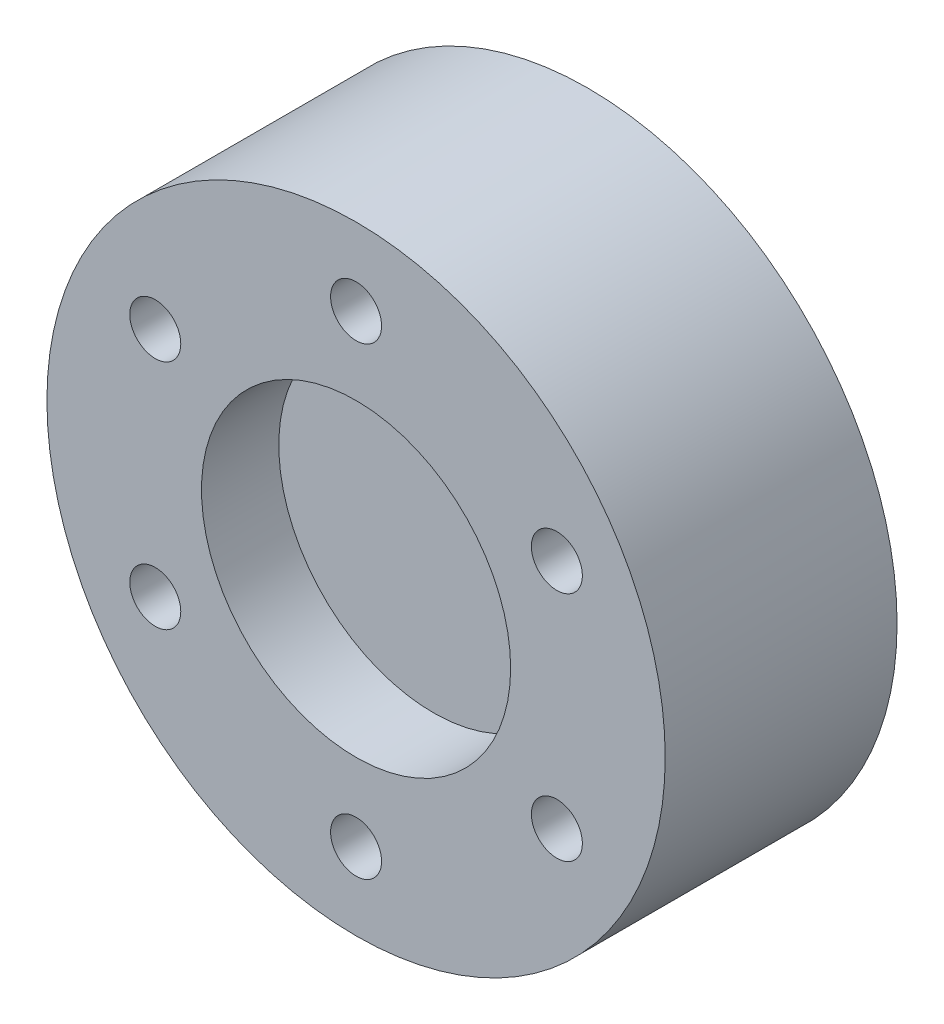
ISO-10303-21;
HEADER;
FILE_DESCRIPTION(('STEP AP214'),'2;1');
FILE_NAME('part.step','',(''),(''),'','','');
FILE_SCHEMA(('AUTOMOTIVE_DESIGN { 1 0 10303 214 1 1 1 1 }'));
ENDSEC;
DATA;
#1=APPLICATION_CONTEXT('core data for automotive mechanical design processes');
#2=APPLICATION_PROTOCOL_DEFINITION('international standard','automotive_design',2000,#1);
#3=PRODUCT_CONTEXT('',#1,'mechanical');
#4=PRODUCT('Part','Part','',(#3));
#5=PRODUCT_RELATED_PRODUCT_CATEGORY('part','',(#4));
#6=PRODUCT_DEFINITION_FORMATION('','',#4);
#7=PRODUCT_DEFINITION_CONTEXT('part definition',#1,'design');
#8=PRODUCT_DEFINITION('design','',#6,#7);
#9=PRODUCT_DEFINITION_SHAPE('','',#8);
#10=(LENGTH_UNIT() NAMED_UNIT(*) SI_UNIT(.MILLI.,.METRE.));
#11=(NAMED_UNIT(*) PLANE_ANGLE_UNIT() SI_UNIT($,.RADIAN.));
#12=(NAMED_UNIT(*) SI_UNIT($,.STERADIAN.) SOLID_ANGLE_UNIT());
#13=UNCERTAINTY_MEASURE_WITH_UNIT(LENGTH_MEASURE(1.E-05),#10,'distance_accuracy_value','');
#14=(GEOMETRIC_REPRESENTATION_CONTEXT(3) GLOBAL_UNCERTAINTY_ASSIGNED_CONTEXT((#13)) GLOBAL_UNIT_ASSIGNED_CONTEXT((#10,
#11,#12)) REPRESENTATION_CONTEXT('',''));
#15=CARTESIAN_POINT('',(0.,0.,0.));
#16=DIRECTION('',(0.,0.,1.));
#17=DIRECTION('',(1.,0.,0.));
#18=AXIS2_PLACEMENT_3D('',#15,#16,#17);
#19=CARTESIAN_POINT('',(0.,0.,15.));
#20=DIRECTION('',(0.,0.,-1.));
#21=DIRECTION('',(-1.,0.,0.));
#22=AXIS2_PLACEMENT_3D('',#19,#20,#21);
#23=CYLINDRICAL_SURFACE('',#22,20.);
#24=CARTESIAN_POINT('',(0.,0.,15.));
#25=DIRECTION('',(0.,0.,1.));
#26=DIRECTION('',(1.,0.,0.));
#27=AXIS2_PLACEMENT_3D('',#24,#25,#26);
#28=CIRCLE('',#27,20.);
#29=CARTESIAN_POINT('',(20.,0.,15.));
#30=VERTEX_POINT('',#29);
#31=EDGE_CURVE('E11',#30,#30,#28,.T.);
#32=ORIENTED_EDGE('',*,*,#31,.F.);
#33=EDGE_LOOP('',(#32));
#34=FACE_BOUND('',#33,.T.);
#35=CARTESIAN_POINT('',(0.,0.,0.));
#36=DIRECTION('',(0.,0.,1.));
#37=DIRECTION('',(1.,0.,0.));
#38=AXIS2_PLACEMENT_3D('',#35,#36,#37);
#39=CIRCLE('',#38,20.);
#40=CARTESIAN_POINT('',(20.,0.,0.));
#41=VERTEX_POINT('',#40);
#42=EDGE_CURVE('E39',#41,#41,#39,.T.);
#43=ORIENTED_EDGE('',*,*,#42,.T.);
#44=EDGE_LOOP('',(#43));
#45=FACE_BOUND('',#44,.T.);
#46=ADVANCED_FACE('F36',(#34,#45),#23,.T.);
#47=CARTESIAN_POINT('',(0.,0.,15.));
#48=DIRECTION('',(0.,0.,1.));
#49=DIRECTION('',(1.,0.,0.));
#50=AXIS2_PLACEMENT_3D('',#47,#48,#49);
#51=PLANE('',#50);
#52=CARTESIAN_POINT('',(-12.9903810567665,7.50000000000015,15.));
#53=DIRECTION('',(0.,0.,1.));
#54=DIRECTION('',(1.,0.,0.));
#55=AXIS2_PLACEMENT_3D('',#52,#53,#54);
#56=CIRCLE('',#55,1.64999999999999);
#57=CARTESIAN_POINT('',(-11.3403810567665,7.50000000000015,15.));
#58=VERTEX_POINT('',#57);
#59=EDGE_CURVE('E73',#58,#58,#56,.T.);
#60=ORIENTED_EDGE('',*,*,#59,.F.);
#61=EDGE_LOOP('',(#60));
#62=FACE_BOUND('',#61,.T.);
#63=CARTESIAN_POINT('',(-12.9903810567666,-7.49999999999988,15.));
#64=DIRECTION('',(0.,0.,1.));
#65=DIRECTION('',(1.,0.,0.));
#66=AXIS2_PLACEMENT_3D('',#63,#64,#65);
#67=CIRCLE('',#66,1.64999999999999);
#68=CARTESIAN_POINT('',(-11.3403810567667,-7.49999999999988,15.));
#69=VERTEX_POINT('',#68);
#70=EDGE_CURVE('E72',#69,#69,#67,.T.);
#71=ORIENTED_EDGE('',*,*,#70,.F.);
#72=EDGE_LOOP('',(#71));
#73=FACE_BOUND('',#72,.T.);
#74=CARTESIAN_POINT('',(0.,-15.,15.));
#75=DIRECTION('',(0.,0.,1.));
#76=DIRECTION('',(1.,0.,0.));
#77=AXIS2_PLACEMENT_3D('',#74,#75,#76);
#78=CIRCLE('',#77,1.64999999999999);
#79=CARTESIAN_POINT('',(1.64999999999999,-15.,15.));
#80=VERTEX_POINT('',#79);
#81=EDGE_CURVE('E85',#80,#80,#78,.T.);
#82=ORIENTED_EDGE('',*,*,#81,.F.);
#83=EDGE_LOOP('',(#82));
#84=FACE_BOUND('',#83,.T.);
#85=CARTESIAN_POINT('',(12.9903810567665,-7.50000000000006,15.));
#86=DIRECTION('',(0.,0.,1.));
#87=DIRECTION('',(1.,0.,0.));
#88=AXIS2_PLACEMENT_3D('',#85,#86,#87);
#89=CIRCLE('',#88,1.64999999999999);
#90=CARTESIAN_POINT('',(14.6403810567665,-7.50000000000006,15.));
#91=VERTEX_POINT('',#90);
#92=EDGE_CURVE('E91',#91,#91,#89,.T.);
#93=ORIENTED_EDGE('',*,*,#92,.F.);
#94=EDGE_LOOP('',(#93));
#95=FACE_BOUND('',#94,.T.);
#96=CARTESIAN_POINT('',(12.9903810567666,7.49999999999997,15.));
#97=DIRECTION('',(0.,0.,1.));
#98=DIRECTION('',(1.,0.,0.));
#99=AXIS2_PLACEMENT_3D('',#96,#97,#98);
#100=CIRCLE('',#99,1.64999999999999);
#101=CARTESIAN_POINT('',(14.6403810567666,7.49999999999997,15.));
#102=VERTEX_POINT('',#101);
#103=EDGE_CURVE('E97',#102,#102,#100,.T.);
#104=ORIENTED_EDGE('',*,*,#103,.F.);
#105=EDGE_LOOP('',(#104));
#106=FACE_BOUND('',#105,.T.);
#107=CARTESIAN_POINT('',(0.,15.,15.));
#108=DIRECTION('',(0.,0.,1.));
#109=DIRECTION('',(1.,0.,0.));
#110=AXIS2_PLACEMENT_3D('',#107,#108,#109);
#111=CIRCLE('',#110,1.64999999999999);
#112=CARTESIAN_POINT('',(1.64999999999999,15.,15.));
#113=VERTEX_POINT('',#112);
#114=EDGE_CURVE('E103',#113,#113,#111,.T.);
#115=ORIENTED_EDGE('',*,*,#114,.F.);
#116=EDGE_LOOP('',(#115));
#117=FACE_BOUND('',#116,.T.);
#118=CARTESIAN_POINT('',(0.,0.,15.));
#119=DIRECTION('',(0.,0.,1.));
#120=DIRECTION('',(1.,0.,0.));
#121=AXIS2_PLACEMENT_3D('',#118,#119,#120);
#122=CIRCLE('',#121,10.);
#123=CARTESIAN_POINT('',(10.,0.,15.));
#124=VERTEX_POINT('',#123);
#125=EDGE_CURVE('E109',#124,#124,#122,.T.);
#126=ORIENTED_EDGE('',*,*,#125,.F.);
#127=EDGE_LOOP('',(#126));
#128=FACE_BOUND('',#127,.T.);
#129=ORIENTED_EDGE('',*,*,#31,.T.);
#130=EDGE_LOOP('',(#129));
#131=FACE_BOUND('',#130,.T.);
#132=ADVANCED_FACE('F118',(#62,#73,#84,#95,#106,#117,#128,#131),#51,.T.);
#133=CARTESIAN_POINT('',(0.,0.,0.));
#134=DIRECTION('',(0.,0.,1.));
#135=DIRECTION('',(1.,0.,0.));
#136=AXIS2_PLACEMENT_3D('',#133,#134,#135);
#137=PLANE('',#136);
#138=CARTESIAN_POINT('',(0.,0.,0.));
#139=DIRECTION('',(0.,0.,-1.));
#140=DIRECTION('',(-1.,0.,0.));
#141=AXIS2_PLACEMENT_3D('',#138,#139,#140);
#142=CIRCLE('',#141,17.5);
#143=CARTESIAN_POINT('',(-17.5,0.,0.));
#144=VERTEX_POINT('',#143);
#145=EDGE_CURVE('E194',#144,#144,#142,.T.);
#146=ORIENTED_EDGE('',*,*,#145,.F.);
#147=EDGE_LOOP('',(#146));
#148=FACE_BOUND('',#147,.T.);
#149=ORIENTED_EDGE('',*,*,#42,.F.);
#150=EDGE_LOOP('',(#149));
#151=FACE_BOUND('',#150,.T.);
#152=ADVANCED_FACE('F121',(#148,#151),#137,.F.);
#153=CARTESIAN_POINT('',(0.,0.,10.));
#154=DIRECTION('',(0.,0.,1.));
#155=DIRECTION('',(1.,0.,0.));
#156=AXIS2_PLACEMENT_3D('',#153,#154,#155);
#157=CYLINDRICAL_SURFACE('',#156,10.);
#158=CARTESIAN_POINT('',(0.,0.,10.));
#159=DIRECTION('',(0.,0.,1.));
#160=DIRECTION('',(1.,0.,0.));
#161=AXIS2_PLACEMENT_3D('',#158,#159,#160);
#162=CIRCLE('',#161,10.);
#163=CARTESIAN_POINT('',(10.,0.,10.));
#164=VERTEX_POINT('',#163);
#165=EDGE_CURVE('E110',#164,#164,#162,.T.);
#166=ORIENTED_EDGE('',*,*,#165,.F.);
#167=EDGE_LOOP('',(#166));
#168=FACE_BOUND('',#167,.T.);
#169=ORIENTED_EDGE('',*,*,#125,.T.);
#170=EDGE_LOOP('',(#169));
#171=FACE_BOUND('',#170,.T.);
#172=ADVANCED_FACE('F116',(#168,#171),#157,.F.);
#173=CARTESIAN_POINT('',(0.,0.,10.));
#174=DIRECTION('',(0.,0.,1.));
#175=DIRECTION('',(1.,0.,0.));
#176=AXIS2_PLACEMENT_3D('',#173,#174,#175);
#177=PLANE('',#176);
#178=ORIENTED_EDGE('',*,*,#165,.T.);
#179=EDGE_LOOP('',(#178));
#180=FACE_BOUND('',#179,.T.);
#181=ADVANCED_FACE('F136',(#180),#177,.T.);
#182=CARTESIAN_POINT('',(0.,15.,7.9));
#183=DIRECTION('',(0.,0.,1.));
#184=DIRECTION('',(1.,0.,0.));
#185=AXIS2_PLACEMENT_3D('',#182,#183,#184);
#186=CONICAL_SURFACE('',#185,1.65,1.02974425867665);
#187=CARTESIAN_POINT('',(0.,15.,6.90857997860452));
#188=VERTEX_POINT('',#187);
#189=VERTEX_LOOP('',#188);
#190=FACE_BOUND('',#189,.T.);
#191=CARTESIAN_POINT('',(0.,15.,7.9));
#192=DIRECTION('',(0.,0.,1.));
#193=DIRECTION('',(1.,0.,0.));
#194=AXIS2_PLACEMENT_3D('',#191,#192,#193);
#195=CIRCLE('',#194,1.65);
#196=CARTESIAN_POINT('',(1.65,15.,7.9));
#197=VERTEX_POINT('',#196);
#198=EDGE_CURVE('E106',#197,#197,#195,.T.);
#199=ORIENTED_EDGE('',*,*,#198,.T.);
#200=EDGE_LOOP('',(#199));
#201=FACE_BOUND('',#200,.T.);
#202=ADVANCED_FACE('F143',(#190,#201),#186,.F.);
#203=CARTESIAN_POINT('',(0.,15.,15.));
#204=DIRECTION('',(0.,0.,1.));
#205=DIRECTION('',(1.,0.,0.));
#206=AXIS2_PLACEMENT_3D('',#203,#204,#205);
#207=CYLINDRICAL_SURFACE('',#206,1.64999999999999);
#208=ORIENTED_EDGE('',*,*,#198,.F.);
#209=EDGE_LOOP('',(#208));
#210=FACE_BOUND('',#209,.T.);
#211=ORIENTED_EDGE('',*,*,#114,.T.);
#212=EDGE_LOOP('',(#211));
#213=FACE_BOUND('',#212,.T.);
#214=ADVANCED_FACE('F147',(#210,#213),#207,.F.);
#215=CARTESIAN_POINT('',(12.9903810567666,7.49999999999997,7.9));
#216=DIRECTION('',(0.,0.,1.));
#217=DIRECTION('',(1.,0.,0.));
#218=AXIS2_PLACEMENT_3D('',#215,#216,#217);
#219=CONICAL_SURFACE('',#218,1.65,1.02974425867665);
#220=CARTESIAN_POINT('',(12.9903810567666,7.49999999999997,6.90857997860452));
#221=VERTEX_POINT('',#220);
#222=VERTEX_LOOP('',#221);
#223=FACE_BOUND('',#222,.T.);
#224=CARTESIAN_POINT('',(12.9903810567666,7.49999999999997,7.9));
#225=DIRECTION('',(0.,0.,1.));
#226=DIRECTION('',(1.,0.,0.));
#227=AXIS2_PLACEMENT_3D('',#224,#225,#226);
#228=CIRCLE('',#227,1.65);
#229=CARTESIAN_POINT('',(14.6403810567666,7.49999999999997,7.9));
#230=VERTEX_POINT('',#229);
#231=EDGE_CURVE('E100',#230,#230,#228,.T.);
#232=ORIENTED_EDGE('',*,*,#231,.T.);
#233=EDGE_LOOP('',(#232));
#234=FACE_BOUND('',#233,.T.);
#235=ADVANCED_FACE('F150',(#223,#234),#219,.F.);
#236=CARTESIAN_POINT('',(12.9903810567666,7.49999999999997,15.));
#237=DIRECTION('',(0.,0.,1.));
#238=DIRECTION('',(1.,0.,0.));
#239=AXIS2_PLACEMENT_3D('',#236,#237,#238);
#240=CYLINDRICAL_SURFACE('',#239,1.64999999999999);
#241=ORIENTED_EDGE('',*,*,#231,.F.);
#242=EDGE_LOOP('',(#241));
#243=FACE_BOUND('',#242,.T.);
#244=ORIENTED_EDGE('',*,*,#103,.T.);
#245=EDGE_LOOP('',(#244));
#246=FACE_BOUND('',#245,.T.);
#247=ADVANCED_FACE('F154',(#243,#246),#240,.F.);
#248=CARTESIAN_POINT('',(12.9903810567665,-7.50000000000006,7.9));
#249=DIRECTION('',(0.,0.,1.));
#250=DIRECTION('',(1.,0.,0.));
#251=AXIS2_PLACEMENT_3D('',#248,#249,#250);
#252=CONICAL_SURFACE('',#251,1.65,1.02974425867665);
#253=CARTESIAN_POINT('',(12.9903810567665,-7.50000000000006,6.90857997860452));
#254=VERTEX_POINT('',#253);
#255=VERTEX_LOOP('',#254);
#256=FACE_BOUND('',#255,.T.);
#257=CARTESIAN_POINT('',(12.9903810567665,-7.50000000000006,7.9));
#258=DIRECTION('',(0.,0.,1.));
#259=DIRECTION('',(1.,0.,0.));
#260=AXIS2_PLACEMENT_3D('',#257,#258,#259);
#261=CIRCLE('',#260,1.65);
#262=CARTESIAN_POINT('',(14.6403810567665,-7.50000000000006,7.9));
#263=VERTEX_POINT('',#262);
#264=EDGE_CURVE('E94',#263,#263,#261,.T.);
#265=ORIENTED_EDGE('',*,*,#264,.T.);
#266=EDGE_LOOP('',(#265));
#267=FACE_BOUND('',#266,.T.);
#268=ADVANCED_FACE('F157',(#256,#267),#252,.F.);
#269=CARTESIAN_POINT('',(12.9903810567665,-7.50000000000006,15.));
#270=DIRECTION('',(0.,0.,1.));
#271=DIRECTION('',(1.,0.,0.));
#272=AXIS2_PLACEMENT_3D('',#269,#270,#271);
#273=CYLINDRICAL_SURFACE('',#272,1.64999999999999);
#274=ORIENTED_EDGE('',*,*,#264,.F.);
#275=EDGE_LOOP('',(#274));
#276=FACE_BOUND('',#275,.T.);
#277=ORIENTED_EDGE('',*,*,#92,.T.);
#278=EDGE_LOOP('',(#277));
#279=FACE_BOUND('',#278,.T.);
#280=ADVANCED_FACE('F161',(#276,#279),#273,.F.);
#281=CARTESIAN_POINT('',(0.,-15.,7.9));
#282=DIRECTION('',(0.,0.,1.));
#283=DIRECTION('',(1.,0.,0.));
#284=AXIS2_PLACEMENT_3D('',#281,#282,#283);
#285=CONICAL_SURFACE('',#284,1.65,1.02974425867665);
#286=CARTESIAN_POINT('',(0.,-15.,6.90857997860452));
#287=VERTEX_POINT('',#286);
#288=VERTEX_LOOP('',#287);
#289=FACE_BOUND('',#288,.T.);
#290=CARTESIAN_POINT('',(0.,-15.,7.9));
#291=DIRECTION('',(0.,0.,1.));
#292=DIRECTION('',(1.,0.,0.));
#293=AXIS2_PLACEMENT_3D('',#290,#291,#292);
#294=CIRCLE('',#293,1.65);
#295=CARTESIAN_POINT('',(1.65,-15.,7.9));
#296=VERTEX_POINT('',#295);
#297=EDGE_CURVE('E88',#296,#296,#294,.T.);
#298=ORIENTED_EDGE('',*,*,#297,.T.);
#299=EDGE_LOOP('',(#298));
#300=FACE_BOUND('',#299,.T.);
#301=ADVANCED_FACE('F165',(#289,#300),#285,.F.);
#302=CARTESIAN_POINT('',(0.,-15.,15.));
#303=DIRECTION('',(0.,0.,1.));
#304=DIRECTION('',(1.,0.,0.));
#305=AXIS2_PLACEMENT_3D('',#302,#303,#304);
#306=CYLINDRICAL_SURFACE('',#305,1.64999999999999);
#307=ORIENTED_EDGE('',*,*,#297,.F.);
#308=EDGE_LOOP('',(#307));
#309=FACE_BOUND('',#308,.T.);
#310=ORIENTED_EDGE('',*,*,#81,.T.);
#311=EDGE_LOOP('',(#310));
#312=FACE_BOUND('',#311,.T.);
#313=ADVANCED_FACE('F169',(#309,#312),#306,.F.);
#314=CARTESIAN_POINT('',(-12.9903810567666,-7.49999999999988,7.9));
#315=DIRECTION('',(0.,0.,1.));
#316=DIRECTION('',(1.,0.,0.));
#317=AXIS2_PLACEMENT_3D('',#314,#315,#316);
#318=CONICAL_SURFACE('',#317,1.65,1.02974425867665);
#319=CARTESIAN_POINT('',(-12.9903810567667,-7.49999999999988,6.90857997860452));
#320=VERTEX_POINT('',#319);
#321=VERTEX_LOOP('',#320);
#322=FACE_BOUND('',#321,.T.);
#323=CARTESIAN_POINT('',(-12.9903810567666,-7.49999999999988,7.9));
#324=DIRECTION('',(0.,0.,1.));
#325=DIRECTION('',(1.,0.,0.));
#326=AXIS2_PLACEMENT_3D('',#323,#324,#325);
#327=CIRCLE('',#326,1.65);
#328=CARTESIAN_POINT('',(-11.3403810567667,-7.49999999999988,7.9));
#329=VERTEX_POINT('',#328);
#330=EDGE_CURVE('E76',#329,#329,#327,.T.);
#331=ORIENTED_EDGE('',*,*,#330,.T.);
#332=EDGE_LOOP('',(#331));
#333=FACE_BOUND('',#332,.T.);
#334=ADVANCED_FACE('F173',(#322,#333),#318,.F.);
#335=CARTESIAN_POINT('',(-12.9903810567666,-7.49999999999988,15.));
#336=DIRECTION('',(0.,0.,1.));
#337=DIRECTION('',(1.,0.,0.));
#338=AXIS2_PLACEMENT_3D('',#335,#336,#337);
#339=CYLINDRICAL_SURFACE('',#338,1.64999999999999);
#340=ORIENTED_EDGE('',*,*,#330,.F.);
#341=EDGE_LOOP('',(#340));
#342=FACE_BOUND('',#341,.T.);
#343=ORIENTED_EDGE('',*,*,#70,.T.);
#344=EDGE_LOOP('',(#343));
#345=FACE_BOUND('',#344,.T.);
#346=ADVANCED_FACE('F66',(#342,#345),#339,.F.);
#347=CARTESIAN_POINT('',(-12.9903810567665,7.50000000000015,7.9));
#348=DIRECTION('',(0.,0.,1.));
#349=DIRECTION('',(1.,0.,0.));
#350=AXIS2_PLACEMENT_3D('',#347,#348,#349);
#351=CONICAL_SURFACE('',#350,1.65,1.02974425867665);
#352=CARTESIAN_POINT('',(-12.9903810567665,7.50000000000015,6.90857997860452));
#353=VERTEX_POINT('',#352);
#354=VERTEX_LOOP('',#353);
#355=FACE_BOUND('',#354,.T.);
#356=CARTESIAN_POINT('',(-12.9903810567665,7.50000000000015,7.9));
#357=DIRECTION('',(0.,0.,1.));
#358=DIRECTION('',(1.,0.,0.));
#359=AXIS2_PLACEMENT_3D('',#356,#357,#358);
#360=CIRCLE('',#359,1.65);
#361=CARTESIAN_POINT('',(-11.3403810567665,7.50000000000015,7.9));
#362=VERTEX_POINT('',#361);
#363=EDGE_CURVE('E70',#362,#362,#360,.T.);
#364=ORIENTED_EDGE('',*,*,#363,.T.);
#365=EDGE_LOOP('',(#364));
#366=FACE_BOUND('',#365,.T.);
#367=ADVANCED_FACE('F62',(#355,#366),#351,.F.);
#368=CARTESIAN_POINT('',(-12.9903810567665,7.50000000000015,15.));
#369=DIRECTION('',(0.,0.,1.));
#370=DIRECTION('',(1.,0.,0.));
#371=AXIS2_PLACEMENT_3D('',#368,#369,#370);
#372=CYLINDRICAL_SURFACE('',#371,1.64999999999999);
#373=ORIENTED_EDGE('',*,*,#363,.F.);
#374=EDGE_LOOP('',(#373));
#375=FACE_BOUND('',#374,.T.);
#376=ORIENTED_EDGE('',*,*,#59,.T.);
#377=EDGE_LOOP('',(#376));
#378=FACE_BOUND('',#377,.T.);
#379=ADVANCED_FACE('F65',(#375,#378),#372,.F.);
#380=CARTESIAN_POINT('',(0.,0.,3.));
#381=DIRECTION('',(0.,0.,-1.));
#382=DIRECTION('',(-1.,0.,0.));
#383=AXIS2_PLACEMENT_3D('',#380,#381,#382);
#384=CYLINDRICAL_SURFACE('',#383,17.5);
#385=CARTESIAN_POINT('',(0.,0.,3.));
#386=DIRECTION('',(0.,0.,-1.));
#387=DIRECTION('',(-1.,0.,0.));
#388=AXIS2_PLACEMENT_3D('',#385,#386,#387);
#389=CIRCLE('',#388,17.5);
#390=CARTESIAN_POINT('',(-17.5,0.,3.));
#391=VERTEX_POINT('',#390);
#392=EDGE_CURVE('E79',#391,#391,#389,.T.);
#393=ORIENTED_EDGE('',*,*,#392,.F.);
#394=EDGE_LOOP('',(#393));
#395=FACE_BOUND('',#394,.T.);
#396=ORIENTED_EDGE('',*,*,#145,.T.);
#397=EDGE_LOOP('',(#396));
#398=FACE_BOUND('',#397,.T.);
#399=ADVANCED_FACE('F183',(#395,#398),#384,.F.);
#400=CARTESIAN_POINT('',(0.,0.,3.));
#401=DIRECTION('',(0.,0.,-1.));
#402=DIRECTION('',(-1.,0.,0.));
#403=AXIS2_PLACEMENT_3D('',#400,#401,#402);
#404=PLANE('',#403);
#405=ORIENTED_EDGE('',*,*,#392,.T.);
#406=EDGE_LOOP('',(#405));
#407=FACE_BOUND('',#406,.T.);
#408=ADVANCED_FACE('F186',(#407),#404,.T.);
#409=CLOSED_SHELL('',(#46,#132,#152,#172,#181,#202,#214,#235,#247,#268,#280,#301,#313,#334,#346,
#367,#379,#399,#408));
#410=MANIFOLD_SOLID_BREP('B2',#409);
#411=ADVANCED_BREP_SHAPE_REPRESENTATION('',(#18,#410),#14);
#412=SHAPE_DEFINITION_REPRESENTATION(#9,#411);
ENDSEC;
END-ISO-10303-21;
